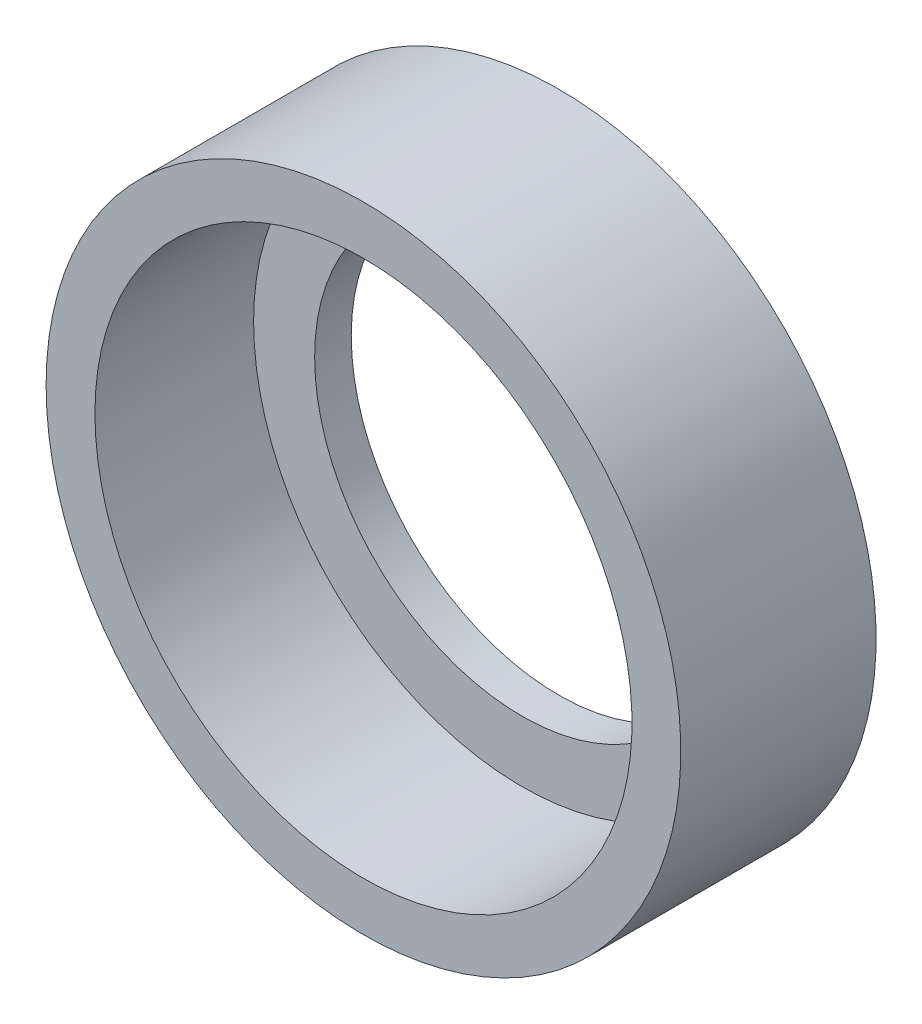
ISO-10303-21;
HEADER;
FILE_DESCRIPTION(('STEP AP214'),'2;1');
FILE_NAME('part.step','',(''),(''),'','','');
FILE_SCHEMA(('AUTOMOTIVE_DESIGN { 1 0 10303 214 1 1 1 1 }'));
ENDSEC;
DATA;
#1=APPLICATION_CONTEXT('core data for automotive mechanical design processes');
#2=APPLICATION_PROTOCOL_DEFINITION('international standard','automotive_design',2000,#1);
#3=PRODUCT_CONTEXT('',#1,'mechanical');
#4=PRODUCT('Part','Part','',(#3));
#5=PRODUCT_RELATED_PRODUCT_CATEGORY('part','',(#4));
#6=PRODUCT_DEFINITION_FORMATION('','',#4);
#7=PRODUCT_DEFINITION_CONTEXT('part definition',#1,'design');
#8=PRODUCT_DEFINITION('design','',#6,#7);
#9=PRODUCT_DEFINITION_SHAPE('','',#8);
#10=(LENGTH_UNIT() NAMED_UNIT(*) SI_UNIT(.MILLI.,.METRE.));
#11=(NAMED_UNIT(*) PLANE_ANGLE_UNIT() SI_UNIT($,.RADIAN.));
#12=(NAMED_UNIT(*) SI_UNIT($,.STERADIAN.) SOLID_ANGLE_UNIT());
#13=UNCERTAINTY_MEASURE_WITH_UNIT(LENGTH_MEASURE(1.E-05),#10,'distance_accuracy_value','');
#14=(GEOMETRIC_REPRESENTATION_CONTEXT(3) GLOBAL_UNCERTAINTY_ASSIGNED_CONTEXT((#13)) GLOBAL_UNIT_ASSIGNED_CONTEXT((#10,
#11,#12)) REPRESENTATION_CONTEXT('',''));
#15=CARTESIAN_POINT('',(0.,0.,0.));
#16=DIRECTION('',(0.,0.,1.));
#17=DIRECTION('',(1.,0.,0.));
#18=AXIS2_PLACEMENT_3D('',#15,#16,#17);
#19=CARTESIAN_POINT('',(0.,0.,0.));
#20=DIRECTION('',(0.,0.,-1.));
#21=DIRECTION('',(-1.,0.,0.));
#22=AXIS2_PLACEMENT_3D('',#19,#20,#21);
#23=CYLINDRICAL_SURFACE('',#22,13.);
#24=CARTESIAN_POINT('',(0.,0.,8.));
#25=DIRECTION('',(0.,0.,-1.));
#26=DIRECTION('',(-1.,0.,0.));
#27=AXIS2_PLACEMENT_3D('',#24,#25,#26);
#28=CIRCLE('',#27,13.);
#29=CARTESIAN_POINT('',(-13.,0.,8.));
#30=VERTEX_POINT('',#29);
#31=EDGE_CURVE('E10',#30,#30,#28,.T.);
#32=ORIENTED_EDGE('',*,*,#31,.T.);
#33=EDGE_LOOP('',(#32));
#34=FACE_BOUND('',#33,.T.);
#35=CARTESIAN_POINT('',(0.,0.,0.));
#36=DIRECTION('',(0.,0.,-1.));
#37=DIRECTION('',(-1.,0.,0.));
#38=AXIS2_PLACEMENT_3D('',#35,#36,#37);
#39=CIRCLE('',#38,13.);
#40=CARTESIAN_POINT('',(-13.,0.,0.));
#41=VERTEX_POINT('',#40);
#42=EDGE_CURVE('E53',#41,#41,#39,.T.);
#43=ORIENTED_EDGE('',*,*,#42,.F.);
#44=EDGE_LOOP('',(#43));
#45=FACE_BOUND('',#44,.T.);
#46=ADVANCED_FACE('F31',(#34,#45),#23,.T.);
#47=CARTESIAN_POINT('',(0.,13.,8.));
#48=DIRECTION('',(0.,0.,1.));
#49=DIRECTION('',(1.,0.,0.));
#50=AXIS2_PLACEMENT_3D('',#47,#48,#49);
#51=PLANE('',#50);
#52=CARTESIAN_POINT('',(0.,0.,8.));
#53=DIRECTION('',(0.,0.,-1.));
#54=DIRECTION('',(-1.,0.,0.));
#55=AXIS2_PLACEMENT_3D('',#52,#53,#54);
#56=CIRCLE('',#55,11.);
#57=CARTESIAN_POINT('',(-11.,0.,8.));
#58=VERTEX_POINT('',#57);
#59=EDGE_CURVE('E37',#58,#58,#56,.T.);
#60=ORIENTED_EDGE('',*,*,#59,.T.);
#61=EDGE_LOOP('',(#60));
#62=FACE_BOUND('',#61,.T.);
#63=ORIENTED_EDGE('',*,*,#31,.F.);
#64=EDGE_LOOP('',(#63));
#65=FACE_BOUND('',#64,.T.);
#66=ADVANCED_FACE('F61',(#62,#65),#51,.T.);
#67=CARTESIAN_POINT('',(0.,0.,0.));
#68=DIRECTION('',(0.,0.,-1.));
#69=DIRECTION('',(-1.,0.,0.));
#70=AXIS2_PLACEMENT_3D('',#67,#68,#69);
#71=CYLINDRICAL_SURFACE('',#70,11.);
#72=CARTESIAN_POINT('',(0.,0.,1.5));
#73=DIRECTION('',(0.,0.,-1.));
#74=DIRECTION('',(-1.,0.,0.));
#75=AXIS2_PLACEMENT_3D('',#72,#73,#74);
#76=CIRCLE('',#75,11.);
#77=CARTESIAN_POINT('',(-11.,0.,1.5));
#78=VERTEX_POINT('',#77);
#79=EDGE_CURVE('E41',#78,#78,#76,.T.);
#80=ORIENTED_EDGE('',*,*,#79,.T.);
#81=EDGE_LOOP('',(#80));
#82=FACE_BOUND('',#81,.T.);
#83=ORIENTED_EDGE('',*,*,#59,.F.);
#84=EDGE_LOOP('',(#83));
#85=FACE_BOUND('',#84,.T.);
#86=ADVANCED_FACE('F65',(#82,#85),#71,.F.);
#87=CARTESIAN_POINT('',(0.,11.,1.5));
#88=DIRECTION('',(0.,0.,1.));
#89=DIRECTION('',(1.,0.,0.));
#90=AXIS2_PLACEMENT_3D('',#87,#88,#89);
#91=PLANE('',#90);
#92=CARTESIAN_POINT('',(0.,0.,1.5));
#93=DIRECTION('',(0.,0.,-1.));
#94=DIRECTION('',(-1.,0.,0.));
#95=AXIS2_PLACEMENT_3D('',#92,#93,#94);
#96=CIRCLE('',#95,8.5);
#97=CARTESIAN_POINT('',(-8.5,0.,1.5));
#98=VERTEX_POINT('',#97);
#99=EDGE_CURVE('E45',#98,#98,#96,.T.);
#100=ORIENTED_EDGE('',*,*,#99,.T.);
#101=EDGE_LOOP('',(#100));
#102=FACE_BOUND('',#101,.T.);
#103=ORIENTED_EDGE('',*,*,#79,.F.);
#104=EDGE_LOOP('',(#103));
#105=FACE_BOUND('',#104,.T.);
#106=ADVANCED_FACE('F69',(#102,#105),#91,.T.);
#107=CARTESIAN_POINT('',(0.,0.,0.));
#108=DIRECTION('',(0.,0.,-1.));
#109=DIRECTION('',(-1.,0.,0.));
#110=AXIS2_PLACEMENT_3D('',#107,#108,#109);
#111=CYLINDRICAL_SURFACE('',#110,8.5);
#112=CARTESIAN_POINT('',(0.,0.,0.));
#113=DIRECTION('',(0.,0.,-1.));
#114=DIRECTION('',(-1.,0.,0.));
#115=AXIS2_PLACEMENT_3D('',#112,#113,#114);
#116=CIRCLE('',#115,8.5);
#117=CARTESIAN_POINT('',(-8.5,0.,0.));
#118=VERTEX_POINT('',#117);
#119=EDGE_CURVE('E50',#118,#118,#116,.T.);
#120=ORIENTED_EDGE('',*,*,#119,.T.);
#121=EDGE_LOOP('',(#120));
#122=FACE_BOUND('',#121,.T.);
#123=ORIENTED_EDGE('',*,*,#99,.F.);
#124=EDGE_LOOP('',(#123));
#125=FACE_BOUND('',#124,.T.);
#126=ADVANCED_FACE('F76',(#122,#125),#111,.F.);
#127=CARTESIAN_POINT('',(0.,8.5,0.));
#128=DIRECTION('',(0.,0.,-1.));
#129=DIRECTION('',(-1.,0.,0.));
#130=AXIS2_PLACEMENT_3D('',#127,#128,#129);
#131=PLANE('',#130);
#132=ORIENTED_EDGE('',*,*,#42,.T.);
#133=EDGE_LOOP('',(#132));
#134=FACE_BOUND('',#133,.T.);
#135=ORIENTED_EDGE('',*,*,#119,.F.);
#136=EDGE_LOOP('',(#135));
#137=FACE_BOUND('',#136,.T.);
#138=ADVANCED_FACE('F57',(#134,#137),#131,.T.);
#139=CLOSED_SHELL('',(#46,#66,#86,#106,#126,#138));
#140=MANIFOLD_SOLID_BREP('B2',#139);
#141=ADVANCED_BREP_SHAPE_REPRESENTATION('',(#18,#140),#14);
#142=SHAPE_DEFINITION_REPRESENTATION(#9,#141);
ENDSEC;
END-ISO-10303-21;
